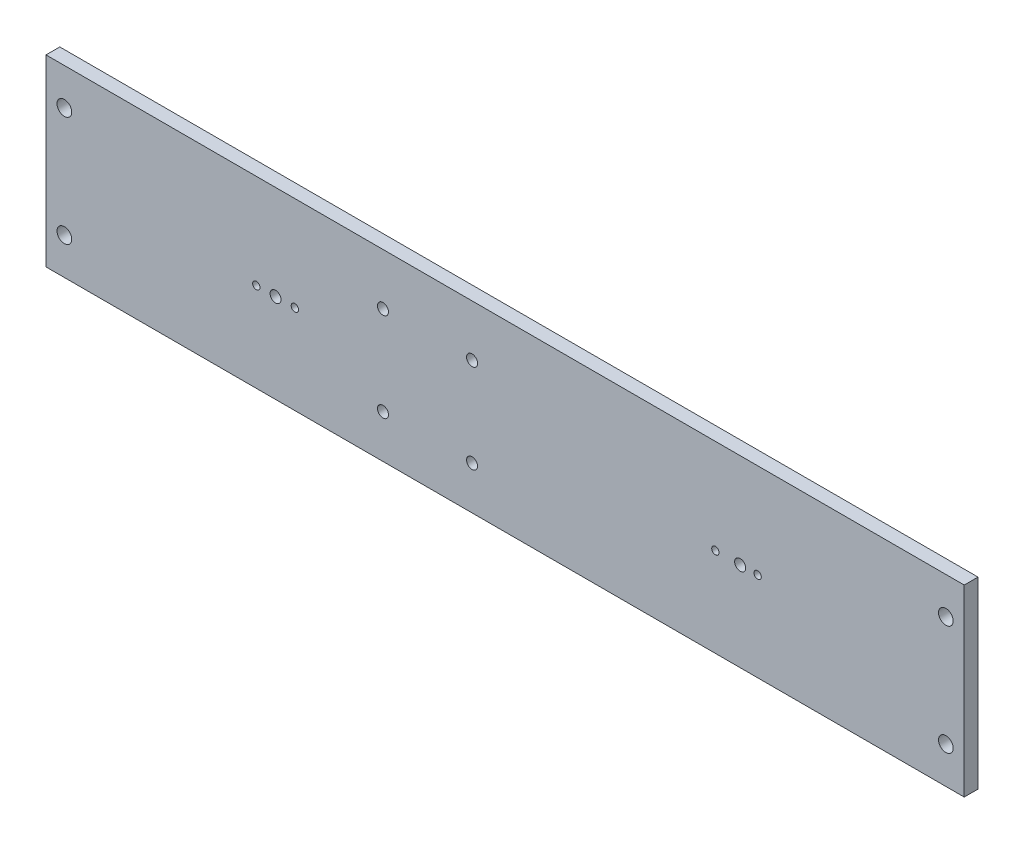
ISO-10303-21;
HEADER;
FILE_DESCRIPTION(('STEP AP214'),'2;1');
FILE_NAME('part.step','',(''),(''),'','','');
FILE_SCHEMA(('AUTOMOTIVE_DESIGN { 1 0 10303 214 1 1 1 1 }'));
ENDSEC;
DATA;
#1=APPLICATION_CONTEXT('core data for automotive mechanical design processes');
#2=APPLICATION_PROTOCOL_DEFINITION('international standard','automotive_design',2000,#1);
#3=PRODUCT_CONTEXT('',#1,'mechanical');
#4=PRODUCT('Part','Part','',(#3));
#5=PRODUCT_RELATED_PRODUCT_CATEGORY('part','',(#4));
#6=PRODUCT_DEFINITION_FORMATION('','',#4);
#7=PRODUCT_DEFINITION_CONTEXT('part definition',#1,'design');
#8=PRODUCT_DEFINITION('design','',#6,#7);
#9=PRODUCT_DEFINITION_SHAPE('','',#8);
#10=(LENGTH_UNIT() NAMED_UNIT(*) SI_UNIT(.MILLI.,.METRE.));
#11=(NAMED_UNIT(*) PLANE_ANGLE_UNIT() SI_UNIT($,.RADIAN.));
#12=(NAMED_UNIT(*) SI_UNIT($,.STERADIAN.) SOLID_ANGLE_UNIT());
#13=UNCERTAINTY_MEASURE_WITH_UNIT(LENGTH_MEASURE(1.E-05),#10,'distance_accuracy_value','');
#14=(GEOMETRIC_REPRESENTATION_CONTEXT(3) GLOBAL_UNCERTAINTY_ASSIGNED_CONTEXT((#13)) GLOBAL_UNIT_ASSIGNED_CONTEXT((#10,
#11,#12)) REPRESENTATION_CONTEXT('',''));
#15=CARTESIAN_POINT('',(0.,0.,0.));
#16=DIRECTION('',(0.,0.,1.));
#17=DIRECTION('',(1.,0.,0.));
#18=AXIS2_PLACEMENT_3D('',#15,#16,#17);
#19=CARTESIAN_POINT('',(0.,100.,7.5));
#20=DIRECTION('',(1.,0.,0.));
#21=DIRECTION('',(0.,1.,0.));
#22=AXIS2_PLACEMENT_3D('',#19,#20,#21);
#23=PLANE('',#22);
#24=DIRECTION('',(0.,-1.,0.));
#25=VECTOR('',#24,1.);
#26=CARTESIAN_POINT('',(0.,100.,0.));
#27=LINE('',#26,#25);
#28=CARTESIAN_POINT('',(0.,100.,0.));
#29=VERTEX_POINT('',#28);
#30=CARTESIAN_POINT('',(0.,0.,0.));
#31=VERTEX_POINT('',#30);
#32=EDGE_CURVE('E100',#29,#31,#27,.T.);
#33=ORIENTED_EDGE('',*,*,#32,.T.);
#34=DIRECTION('',(0.,0.,-1.));
#35=VECTOR('',#34,1.);
#36=CARTESIAN_POINT('',(0.,0.,7.5));
#37=LINE('',#36,#35);
#38=CARTESIAN_POINT('',(0.,0.,7.5));
#39=VERTEX_POINT('',#38);
#40=EDGE_CURVE('E11',#39,#31,#37,.T.);
#41=ORIENTED_EDGE('',*,*,#40,.F.);
#42=DIRECTION('',(0.,-1.,0.));
#43=VECTOR('',#42,1.);
#44=CARTESIAN_POINT('',(0.,100.,7.5));
#45=LINE('',#44,#43);
#46=CARTESIAN_POINT('',(0.,100.,7.5));
#47=VERTEX_POINT('',#46);
#48=EDGE_CURVE('E88',#47,#39,#45,.T.);
#49=ORIENTED_EDGE('',*,*,#48,.F.);
#50=DIRECTION('',(0.,0.,-1.));
#51=VECTOR('',#50,1.);
#52=CARTESIAN_POINT('',(0.,100.,7.5));
#53=LINE('',#52,#51);
#54=EDGE_CURVE('E96',#47,#29,#53,.T.);
#55=ORIENTED_EDGE('',*,*,#54,.T.);
#56=EDGE_LOOP('',(#33,#41,#49,#55));
#57=FACE_BOUND('',#56,.T.);
#58=ADVANCED_FACE('F37',(#57),#23,.F.);
#59=CARTESIAN_POINT('',(0.,0.,7.5));
#60=DIRECTION('',(0.,1.,0.));
#61=DIRECTION('',(0.,0.,1.));
#62=AXIS2_PLACEMENT_3D('',#59,#60,#61);
#63=PLANE('',#62);
#64=DIRECTION('',(1.,0.,0.));
#65=VECTOR('',#64,1.);
#66=CARTESIAN_POINT('',(0.,0.,0.));
#67=LINE('',#66,#65);
#68=CARTESIAN_POINT('',(500.,0.,0.));
#69=VERTEX_POINT('',#68);
#70=EDGE_CURVE('E92',#31,#69,#67,.T.);
#71=ORIENTED_EDGE('',*,*,#70,.T.);
#72=DIRECTION('',(0.,0.,-1.));
#73=VECTOR('',#72,1.);
#74=CARTESIAN_POINT('',(500.,0.,7.5));
#75=LINE('',#74,#73);
#76=CARTESIAN_POINT('',(500.,0.,7.5));
#77=VERTEX_POINT('',#76);
#78=EDGE_CURVE('E45',#77,#69,#75,.T.);
#79=ORIENTED_EDGE('',*,*,#78,.F.);
#80=DIRECTION('',(1.,0.,0.));
#81=VECTOR('',#80,1.);
#82=CARTESIAN_POINT('',(0.,0.,7.5));
#83=LINE('',#82,#81);
#84=EDGE_CURVE('E83',#39,#77,#83,.T.);
#85=ORIENTED_EDGE('',*,*,#84,.F.);
#86=ORIENTED_EDGE('',*,*,#40,.T.);
#87=EDGE_LOOP('',(#71,#79,#85,#86));
#88=FACE_BOUND('',#87,.T.);
#89=ADVANCED_FACE('F91',(#88),#63,.F.);
#90=CARTESIAN_POINT('',(500.,100.,7.5));
#91=DIRECTION('',(-1.,0.,0.));
#92=DIRECTION('',(0.,0.,1.));
#93=AXIS2_PLACEMENT_3D('',#90,#91,#92);
#94=PLANE('',#93);
#95=DIRECTION('',(0.,1.,0.));
#96=VECTOR('',#95,1.);
#97=CARTESIAN_POINT('',(500.,100.,0.));
#98=LINE('',#97,#96);
#99=CARTESIAN_POINT('',(500.,100.,0.));
#100=VERTEX_POINT('',#99);
#101=EDGE_CURVE('E70',#69,#100,#98,.T.);
#102=ORIENTED_EDGE('',*,*,#101,.T.);
#103=DIRECTION('',(0.,0.,-1.));
#104=VECTOR('',#103,1.);
#105=CARTESIAN_POINT('',(500.,100.,7.5));
#106=LINE('',#105,#104);
#107=CARTESIAN_POINT('',(500.,100.,7.5));
#108=VERTEX_POINT('',#107);
#109=EDGE_CURVE('E93',#108,#100,#106,.T.);
#110=ORIENTED_EDGE('',*,*,#109,.F.);
#111=DIRECTION('',(0.,1.,0.));
#112=VECTOR('',#111,1.);
#113=CARTESIAN_POINT('',(500.,100.,7.5));
#114=LINE('',#113,#112);
#115=EDGE_CURVE('E86',#77,#108,#114,.T.);
#116=ORIENTED_EDGE('',*,*,#115,.F.);
#117=ORIENTED_EDGE('',*,*,#78,.T.);
#118=EDGE_LOOP('',(#102,#110,#116,#117));
#119=FACE_BOUND('',#118,.T.);
#120=ADVANCED_FACE('F94',(#119),#94,.F.);
#121=CARTESIAN_POINT('',(0.,100.,7.5));
#122=DIRECTION('',(0.,-1.,0.));
#123=DIRECTION('',(0.,0.,-1.));
#124=AXIS2_PLACEMENT_3D('',#121,#122,#123);
#125=PLANE('',#124);
#126=DIRECTION('',(-1.,0.,0.));
#127=VECTOR('',#126,1.);
#128=CARTESIAN_POINT('',(0.,100.,0.));
#129=LINE('',#128,#127);
#130=EDGE_CURVE('E76',#100,#29,#129,.T.);
#131=ORIENTED_EDGE('',*,*,#130,.T.);
#132=ORIENTED_EDGE('',*,*,#54,.F.);
#133=DIRECTION('',(-1.,0.,0.));
#134=VECTOR('',#133,1.);
#135=CARTESIAN_POINT('',(0.,100.,7.5));
#136=LINE('',#135,#134);
#137=EDGE_CURVE('E53',#108,#47,#136,.T.);
#138=ORIENTED_EDGE('',*,*,#137,.F.);
#139=ORIENTED_EDGE('',*,*,#109,.T.);
#140=EDGE_LOOP('',(#131,#132,#138,#139));
#141=FACE_BOUND('',#140,.T.);
#142=ADVANCED_FACE('F108',(#141),#125,.F.);
#143=CARTESIAN_POINT('',(0.,0.,7.5));
#144=DIRECTION('',(0.,0.,1.));
#145=DIRECTION('',(1.,0.,0.));
#146=AXIS2_PLACEMENT_3D('',#143,#144,#145);
#147=PLANE('',#146);
#148=CARTESIAN_POINT('',(10.0000000000006,20.,7.5));
#149=DIRECTION('',(0.,0.,1.));
#150=DIRECTION('',(1.,0.,0.));
#151=AXIS2_PLACEMENT_3D('',#148,#149,#150);
#152=CIRCLE('',#151,4.);
#153=CARTESIAN_POINT('',(14.0000000000006,20.,7.5));
#154=VERTEX_POINT('',#153);
#155=EDGE_CURVE('E187',#154,#154,#152,.T.);
#156=ORIENTED_EDGE('',*,*,#155,.F.);
#157=EDGE_LOOP('',(#156));
#158=FACE_BOUND('',#157,.T.);
#159=CARTESIAN_POINT('',(490.,80.,7.5));
#160=DIRECTION('',(0.,0.,1.));
#161=DIRECTION('',(1.,0.,0.));
#162=AXIS2_PLACEMENT_3D('',#159,#160,#161);
#163=CIRCLE('',#162,3.99999999999999);
#164=CARTESIAN_POINT('',(494.,80.,7.5));
#165=VERTEX_POINT('',#164);
#166=EDGE_CURVE('E180',#165,#165,#163,.T.);
#167=ORIENTED_EDGE('',*,*,#166,.F.);
#168=EDGE_LOOP('',(#167));
#169=FACE_BOUND('',#168,.T.);
#170=CARTESIAN_POINT('',(490.000000000001,20.,7.5));
#171=DIRECTION('',(0.,0.,1.));
#172=DIRECTION('',(1.,0.,0.));
#173=AXIS2_PLACEMENT_3D('',#170,#171,#172);
#174=CIRCLE('',#173,3.99999999999999);
#175=CARTESIAN_POINT('',(494.000000000001,20.,7.5));
#176=VERTEX_POINT('',#175);
#177=EDGE_CURVE('E192',#176,#176,#174,.T.);
#178=ORIENTED_EDGE('',*,*,#177,.F.);
#179=EDGE_LOOP('',(#178));
#180=FACE_BOUND('',#179,.T.);
#181=CARTESIAN_POINT('',(10.,80.,7.5));
#182=DIRECTION('',(0.,0.,1.));
#183=DIRECTION('',(1.,0.,0.));
#184=AXIS2_PLACEMENT_3D('',#181,#182,#183);
#185=CIRCLE('',#184,4.);
#186=CARTESIAN_POINT('',(14.,80.,7.5));
#187=VERTEX_POINT('',#186);
#188=EDGE_CURVE('E174',#187,#187,#185,.T.);
#189=ORIENTED_EDGE('',*,*,#188,.F.);
#190=EDGE_LOOP('',(#189));
#191=FACE_BOUND('',#190,.T.);
#192=CARTESIAN_POINT('',(135.5,48.5,7.5));
#193=DIRECTION('',(0.,0.,1.));
#194=DIRECTION('',(1.,0.,0.));
#195=AXIS2_PLACEMENT_3D('',#192,#193,#194);
#196=CIRCLE('',#195,2.);
#197=CARTESIAN_POINT('',(137.5,48.5,7.5));
#198=VERTEX_POINT('',#197);
#199=EDGE_CURVE('E163',#198,#198,#196,.T.);
#200=ORIENTED_EDGE('',*,*,#199,.F.);
#201=EDGE_LOOP('',(#200));
#202=FACE_BOUND('',#201,.T.);
#203=CARTESIAN_POINT('',(114.5,48.5,7.5));
#204=DIRECTION('',(0.,0.,1.));
#205=DIRECTION('',(1.,0.,0.));
#206=AXIS2_PLACEMENT_3D('',#203,#204,#205);
#207=CIRCLE('',#206,2.);
#208=CARTESIAN_POINT('',(116.5,48.5,7.5));
#209=VERTEX_POINT('',#208);
#210=EDGE_CURVE('E157',#209,#209,#207,.T.);
#211=ORIENTED_EDGE('',*,*,#210,.F.);
#212=EDGE_LOOP('',(#211));
#213=FACE_BOUND('',#212,.T.);
#214=CARTESIAN_POINT('',(378.,48.5,7.5));
#215=DIRECTION('',(0.,0.,1.));
#216=DIRECTION('',(1.,0.,0.));
#217=AXIS2_PLACEMENT_3D('',#214,#215,#216);
#218=CIRCLE('',#217,2.99999999999994);
#219=CARTESIAN_POINT('',(381.,48.5,7.5));
#220=VERTEX_POINT('',#219);
#221=EDGE_CURVE('E151',#220,#220,#218,.T.);
#222=ORIENTED_EDGE('',*,*,#221,.F.);
#223=EDGE_LOOP('',(#222));
#224=FACE_BOUND('',#223,.T.);
#225=CARTESIAN_POINT('',(387.5,48.5,7.5));
#226=DIRECTION('',(0.,0.,1.));
#227=DIRECTION('',(1.,0.,0.));
#228=AXIS2_PLACEMENT_3D('',#225,#226,#227);
#229=CIRCLE('',#228,2.);
#230=CARTESIAN_POINT('',(389.5,48.5,7.5));
#231=VERTEX_POINT('',#230);
#232=EDGE_CURVE('E144',#231,#231,#229,.T.);
#233=ORIENTED_EDGE('',*,*,#232,.F.);
#234=EDGE_LOOP('',(#233));
#235=FACE_BOUND('',#234,.T.);
#236=CARTESIAN_POINT('',(364.5,48.5,7.5));
#237=DIRECTION('',(0.,0.,1.));
#238=DIRECTION('',(1.,0.,0.));
#239=AXIS2_PLACEMENT_3D('',#236,#237,#238);
#240=CIRCLE('',#239,2.);
#241=CARTESIAN_POINT('',(366.5,48.5,7.5));
#242=VERTEX_POINT('',#241);
#243=EDGE_CURVE('E168',#242,#242,#240,.T.);
#244=ORIENTED_EDGE('',*,*,#243,.F.);
#245=EDGE_LOOP('',(#244));
#246=FACE_BOUND('',#245,.T.);
#247=CARTESIAN_POINT('',(125.,48.5,7.5));
#248=DIRECTION('',(0.,0.,1.));
#249=DIRECTION('',(1.,0.,0.));
#250=AXIS2_PLACEMENT_3D('',#247,#248,#249);
#251=CIRCLE('',#250,2.99999999999999);
#252=CARTESIAN_POINT('',(128.,48.5,7.5));
#253=VERTEX_POINT('',#252);
#254=EDGE_CURVE('E138',#253,#253,#251,.T.);
#255=ORIENTED_EDGE('',*,*,#254,.F.);
#256=EDGE_LOOP('',(#255));
#257=FACE_BOUND('',#256,.T.);
#258=CARTESIAN_POINT('',(183.5,72.,7.5));
#259=DIRECTION('',(0.,0.,1.));
#260=DIRECTION('',(1.,0.,0.));
#261=AXIS2_PLACEMENT_3D('',#258,#259,#260);
#262=CIRCLE('',#261,2.99999999999999);
#263=CARTESIAN_POINT('',(186.5,72.,7.5));
#264=VERTEX_POINT('',#263);
#265=EDGE_CURVE('E127',#264,#264,#262,.T.);
#266=ORIENTED_EDGE('',*,*,#265,.F.);
#267=EDGE_LOOP('',(#266));
#268=FACE_BOUND('',#267,.T.);
#269=CARTESIAN_POINT('',(232.,23.5,7.5));
#270=DIRECTION('',(0.,0.,1.));
#271=DIRECTION('',(1.,0.,0.));
#272=AXIS2_PLACEMENT_3D('',#269,#270,#271);
#273=CIRCLE('',#272,2.99999999999999);
#274=CARTESIAN_POINT('',(235.,23.5,7.5));
#275=VERTEX_POINT('',#274);
#276=EDGE_CURVE('E120',#275,#275,#273,.T.);
#277=ORIENTED_EDGE('',*,*,#276,.F.);
#278=EDGE_LOOP('',(#277));
#279=FACE_BOUND('',#278,.T.);
#280=CARTESIAN_POINT('',(232.,72.,7.5));
#281=DIRECTION('',(0.,0.,1.));
#282=DIRECTION('',(1.,0.,0.));
#283=AXIS2_PLACEMENT_3D('',#280,#281,#282);
#284=CIRCLE('',#283,2.99999999999999);
#285=CARTESIAN_POINT('',(235.,72.,7.5));
#286=VERTEX_POINT('',#285);
#287=EDGE_CURVE('E132',#286,#286,#284,.T.);
#288=ORIENTED_EDGE('',*,*,#287,.F.);
#289=EDGE_LOOP('',(#288));
#290=FACE_BOUND('',#289,.T.);
#291=CARTESIAN_POINT('',(183.5,23.5,7.5));
#292=DIRECTION('',(0.,0.,1.));
#293=DIRECTION('',(1.,0.,0.));
#294=AXIS2_PLACEMENT_3D('',#291,#292,#293);
#295=CIRCLE('',#294,2.99999999999999);
#296=CARTESIAN_POINT('',(186.5,23.5,7.5));
#297=VERTEX_POINT('',#296);
#298=EDGE_CURVE('E114',#297,#297,#295,.T.);
#299=ORIENTED_EDGE('',*,*,#298,.F.);
#300=EDGE_LOOP('',(#299));
#301=FACE_BOUND('',#300,.T.);
#302=ORIENTED_EDGE('',*,*,#48,.T.);
#303=ORIENTED_EDGE('',*,*,#84,.T.);
#304=ORIENTED_EDGE('',*,*,#115,.T.);
#305=ORIENTED_EDGE('',*,*,#137,.T.);
#306=EDGE_LOOP('',(#302,#303,#304,#305));
#307=FACE_BOUND('',#306,.T.);
#308=ADVANCED_FACE('F84',(#158,#169,#180,#191,#202,#213,#224,#235,#246,#257,#268,#279,#290,#301,
#307),#147,.T.);
#309=CARTESIAN_POINT('',(0.,0.,0.));
#310=DIRECTION('',(0.,0.,1.));
#311=DIRECTION('',(1.,0.,0.));
#312=AXIS2_PLACEMENT_3D('',#309,#310,#311);
#313=PLANE('',#312);
#314=CARTESIAN_POINT('',(10.0000000000006,20.,0.));
#315=DIRECTION('',(0.,0.,1.));
#316=DIRECTION('',(1.,0.,0.));
#317=AXIS2_PLACEMENT_3D('',#314,#315,#316);
#318=CIRCLE('',#317,4.);
#319=CARTESIAN_POINT('',(14.0000000000006,20.,0.));
#320=VERTEX_POINT('',#319);
#321=EDGE_CURVE('E177',#320,#320,#318,.T.);
#322=ORIENTED_EDGE('',*,*,#321,.T.);
#323=EDGE_LOOP('',(#322));
#324=FACE_BOUND('',#323,.T.);
#325=CARTESIAN_POINT('',(490.,80.,0.));
#326=DIRECTION('',(0.,0.,1.));
#327=DIRECTION('',(1.,0.,0.));
#328=AXIS2_PLACEMENT_3D('',#325,#326,#327);
#329=CIRCLE('',#328,3.99999999999999);
#330=CARTESIAN_POINT('',(494.,80.,0.));
#331=VERTEX_POINT('',#330);
#332=EDGE_CURVE('E183',#331,#331,#329,.T.);
#333=ORIENTED_EDGE('',*,*,#332,.T.);
#334=EDGE_LOOP('',(#333));
#335=FACE_BOUND('',#334,.T.);
#336=CARTESIAN_POINT('',(490.000000000001,20.,0.));
#337=DIRECTION('',(0.,0.,1.));
#338=DIRECTION('',(1.,0.,0.));
#339=AXIS2_PLACEMENT_3D('',#336,#337,#338);
#340=CIRCLE('',#339,3.99999999999999);
#341=CARTESIAN_POINT('',(494.000000000001,20.,0.));
#342=VERTEX_POINT('',#341);
#343=EDGE_CURVE('E184',#342,#342,#340,.T.);
#344=ORIENTED_EDGE('',*,*,#343,.T.);
#345=EDGE_LOOP('',(#344));
#346=FACE_BOUND('',#345,.T.);
#347=CARTESIAN_POINT('',(10.,80.,0.));
#348=DIRECTION('',(0.,0.,1.));
#349=DIRECTION('',(1.,0.,0.));
#350=AXIS2_PLACEMENT_3D('',#347,#348,#349);
#351=CIRCLE('',#350,4.);
#352=CARTESIAN_POINT('',(14.,80.,0.));
#353=VERTEX_POINT('',#352);
#354=EDGE_CURVE('E171',#353,#353,#351,.T.);
#355=ORIENTED_EDGE('',*,*,#354,.T.);
#356=EDGE_LOOP('',(#355));
#357=FACE_BOUND('',#356,.T.);
#358=CARTESIAN_POINT('',(135.5,48.5,0.));
#359=DIRECTION('',(0.,0.,1.));
#360=DIRECTION('',(1.,0.,0.));
#361=AXIS2_PLACEMENT_3D('',#358,#359,#360);
#362=CIRCLE('',#361,2.);
#363=CARTESIAN_POINT('',(137.5,48.5,0.));
#364=VERTEX_POINT('',#363);
#365=EDGE_CURVE('E141',#364,#364,#362,.T.);
#366=ORIENTED_EDGE('',*,*,#365,.T.);
#367=EDGE_LOOP('',(#366));
#368=FACE_BOUND('',#367,.T.);
#369=CARTESIAN_POINT('',(114.5,48.5,0.));
#370=DIRECTION('',(0.,0.,1.));
#371=DIRECTION('',(1.,0.,0.));
#372=AXIS2_PLACEMENT_3D('',#369,#370,#371);
#373=CIRCLE('',#372,2.);
#374=CARTESIAN_POINT('',(116.5,48.5,0.));
#375=VERTEX_POINT('',#374);
#376=EDGE_CURVE('E160',#375,#375,#373,.T.);
#377=ORIENTED_EDGE('',*,*,#376,.T.);
#378=EDGE_LOOP('',(#377));
#379=FACE_BOUND('',#378,.T.);
#380=CARTESIAN_POINT('',(378.,48.5,0.));
#381=DIRECTION('',(0.,0.,1.));
#382=DIRECTION('',(1.,0.,0.));
#383=AXIS2_PLACEMENT_3D('',#380,#381,#382);
#384=CIRCLE('',#383,2.99999999999994);
#385=CARTESIAN_POINT('',(381.,48.5,0.));
#386=VERTEX_POINT('',#385);
#387=EDGE_CURVE('E154',#386,#386,#384,.T.);
#388=ORIENTED_EDGE('',*,*,#387,.T.);
#389=EDGE_LOOP('',(#388));
#390=FACE_BOUND('',#389,.T.);
#391=CARTESIAN_POINT('',(387.5,48.5,0.));
#392=DIRECTION('',(0.,0.,1.));
#393=DIRECTION('',(1.,0.,0.));
#394=AXIS2_PLACEMENT_3D('',#391,#392,#393);
#395=CIRCLE('',#394,2.);
#396=CARTESIAN_POINT('',(389.5,48.5,0.));
#397=VERTEX_POINT('',#396);
#398=EDGE_CURVE('E147',#397,#397,#395,.T.);
#399=ORIENTED_EDGE('',*,*,#398,.T.);
#400=EDGE_LOOP('',(#399));
#401=FACE_BOUND('',#400,.T.);
#402=CARTESIAN_POINT('',(364.5,48.5,0.));
#403=DIRECTION('',(0.,0.,1.));
#404=DIRECTION('',(1.,0.,0.));
#405=AXIS2_PLACEMENT_3D('',#402,#403,#404);
#406=CIRCLE('',#405,2.);
#407=CARTESIAN_POINT('',(366.5,48.5,0.));
#408=VERTEX_POINT('',#407);
#409=EDGE_CURVE('E148',#408,#408,#406,.T.);
#410=ORIENTED_EDGE('',*,*,#409,.T.);
#411=EDGE_LOOP('',(#410));
#412=FACE_BOUND('',#411,.T.);
#413=CARTESIAN_POINT('',(125.,48.5,0.));
#414=DIRECTION('',(0.,0.,1.));
#415=DIRECTION('',(1.,0.,0.));
#416=AXIS2_PLACEMENT_3D('',#413,#414,#415);
#417=CIRCLE('',#416,2.99999999999999);
#418=CARTESIAN_POINT('',(128.,48.5,0.));
#419=VERTEX_POINT('',#418);
#420=EDGE_CURVE('E135',#419,#419,#417,.T.);
#421=ORIENTED_EDGE('',*,*,#420,.T.);
#422=EDGE_LOOP('',(#421));
#423=FACE_BOUND('',#422,.T.);
#424=CARTESIAN_POINT('',(183.5,72.,0.));
#425=DIRECTION('',(0.,0.,1.));
#426=DIRECTION('',(1.,0.,0.));
#427=AXIS2_PLACEMENT_3D('',#424,#425,#426);
#428=CIRCLE('',#427,2.99999999999999);
#429=CARTESIAN_POINT('',(186.5,72.,0.));
#430=VERTEX_POINT('',#429);
#431=EDGE_CURVE('E117',#430,#430,#428,.T.);
#432=ORIENTED_EDGE('',*,*,#431,.T.);
#433=EDGE_LOOP('',(#432));
#434=FACE_BOUND('',#433,.T.);
#435=CARTESIAN_POINT('',(232.,23.5,0.));
#436=DIRECTION('',(0.,0.,1.));
#437=DIRECTION('',(1.,0.,0.));
#438=AXIS2_PLACEMENT_3D('',#435,#436,#437);
#439=CIRCLE('',#438,2.99999999999999);
#440=CARTESIAN_POINT('',(235.,23.5,0.));
#441=VERTEX_POINT('',#440);
#442=EDGE_CURVE('E123',#441,#441,#439,.T.);
#443=ORIENTED_EDGE('',*,*,#442,.T.);
#444=EDGE_LOOP('',(#443));
#445=FACE_BOUND('',#444,.T.);
#446=CARTESIAN_POINT('',(232.,72.,0.));
#447=DIRECTION('',(0.,0.,1.));
#448=DIRECTION('',(1.,0.,0.));
#449=AXIS2_PLACEMENT_3D('',#446,#447,#448);
#450=CIRCLE('',#449,2.99999999999999);
#451=CARTESIAN_POINT('',(235.,72.,0.));
#452=VERTEX_POINT('',#451);
#453=EDGE_CURVE('E124',#452,#452,#450,.T.);
#454=ORIENTED_EDGE('',*,*,#453,.T.);
#455=EDGE_LOOP('',(#454));
#456=FACE_BOUND('',#455,.T.);
#457=CARTESIAN_POINT('',(183.5,23.5,0.));
#458=DIRECTION('',(0.,0.,1.));
#459=DIRECTION('',(1.,0.,0.));
#460=AXIS2_PLACEMENT_3D('',#457,#458,#459);
#461=CIRCLE('',#460,2.99999999999999);
#462=CARTESIAN_POINT('',(186.5,23.5,0.));
#463=VERTEX_POINT('',#462);
#464=EDGE_CURVE('E103',#463,#463,#461,.T.);
#465=ORIENTED_EDGE('',*,*,#464,.T.);
#466=EDGE_LOOP('',(#465));
#467=FACE_BOUND('',#466,.T.);
#468=ORIENTED_EDGE('',*,*,#32,.F.);
#469=ORIENTED_EDGE('',*,*,#130,.F.);
#470=ORIENTED_EDGE('',*,*,#101,.F.);
#471=ORIENTED_EDGE('',*,*,#70,.F.);
#472=EDGE_LOOP('',(#468,#469,#470,#471));
#473=FACE_BOUND('',#472,.T.);
#474=ADVANCED_FACE('F111',(#324,#335,#346,#357,#368,#379,#390,#401,#412,#423,#434,#445,#456,
#467,#473),#313,.F.);
#475=CARTESIAN_POINT('',(183.5,23.5,0.));
#476=DIRECTION('',(0.,0.,1.));
#477=DIRECTION('',(1.,0.,0.));
#478=AXIS2_PLACEMENT_3D('',#475,#476,#477);
#479=CYLINDRICAL_SURFACE('',#478,2.99999999999999);
#480=ORIENTED_EDGE('',*,*,#464,.F.);
#481=EDGE_LOOP('',(#480));
#482=FACE_BOUND('',#481,.T.);
#483=ORIENTED_EDGE('',*,*,#298,.T.);
#484=EDGE_LOOP('',(#483));
#485=FACE_BOUND('',#484,.T.);
#486=ADVANCED_FACE('F234',(#482,#485),#479,.F.);
#487=CARTESIAN_POINT('',(232.,72.,0.));
#488=DIRECTION('',(0.,0.,1.));
#489=DIRECTION('',(1.,0.,0.));
#490=AXIS2_PLACEMENT_3D('',#487,#488,#489);
#491=CYLINDRICAL_SURFACE('',#490,2.99999999999999);
#492=ORIENTED_EDGE('',*,*,#453,.F.);
#493=EDGE_LOOP('',(#492));
#494=FACE_BOUND('',#493,.T.);
#495=ORIENTED_EDGE('',*,*,#287,.T.);
#496=EDGE_LOOP('',(#495));
#497=FACE_BOUND('',#496,.T.);
#498=ADVANCED_FACE('F236',(#494,#497),#491,.F.);
#499=CARTESIAN_POINT('',(232.,23.5,0.));
#500=DIRECTION('',(0.,0.,1.));
#501=DIRECTION('',(1.,0.,0.));
#502=AXIS2_PLACEMENT_3D('',#499,#500,#501);
#503=CYLINDRICAL_SURFACE('',#502,2.99999999999999);
#504=ORIENTED_EDGE('',*,*,#442,.F.);
#505=EDGE_LOOP('',(#504));
#506=FACE_BOUND('',#505,.T.);
#507=ORIENTED_EDGE('',*,*,#276,.T.);
#508=EDGE_LOOP('',(#507));
#509=FACE_BOUND('',#508,.T.);
#510=ADVANCED_FACE('F243',(#506,#509),#503,.F.);
#511=CARTESIAN_POINT('',(183.5,72.,0.));
#512=DIRECTION('',(0.,0.,1.));
#513=DIRECTION('',(1.,0.,0.));
#514=AXIS2_PLACEMENT_3D('',#511,#512,#513);
#515=CYLINDRICAL_SURFACE('',#514,2.99999999999999);
#516=ORIENTED_EDGE('',*,*,#431,.F.);
#517=EDGE_LOOP('',(#516));
#518=FACE_BOUND('',#517,.T.);
#519=ORIENTED_EDGE('',*,*,#265,.T.);
#520=EDGE_LOOP('',(#519));
#521=FACE_BOUND('',#520,.T.);
#522=ADVANCED_FACE('F338',(#518,#521),#515,.F.);
#523=CARTESIAN_POINT('',(125.,48.5,0.));
#524=DIRECTION('',(0.,0.,1.));
#525=DIRECTION('',(1.,0.,0.));
#526=AXIS2_PLACEMENT_3D('',#523,#524,#525);
#527=CYLINDRICAL_SURFACE('',#526,2.99999999999999);
#528=ORIENTED_EDGE('',*,*,#420,.F.);
#529=EDGE_LOOP('',(#528));
#530=FACE_BOUND('',#529,.T.);
#531=ORIENTED_EDGE('',*,*,#254,.T.);
#532=EDGE_LOOP('',(#531));
#533=FACE_BOUND('',#532,.T.);
#534=ADVANCED_FACE('F322',(#530,#533),#527,.F.);
#535=CARTESIAN_POINT('',(364.5,48.5,0.));
#536=DIRECTION('',(0.,0.,1.));
#537=DIRECTION('',(1.,0.,0.));
#538=AXIS2_PLACEMENT_3D('',#535,#536,#537);
#539=CYLINDRICAL_SURFACE('',#538,2.);
#540=ORIENTED_EDGE('',*,*,#409,.F.);
#541=EDGE_LOOP('',(#540));
#542=FACE_BOUND('',#541,.T.);
#543=ORIENTED_EDGE('',*,*,#243,.T.);
#544=EDGE_LOOP('',(#543));
#545=FACE_BOUND('',#544,.T.);
#546=ADVANCED_FACE('F318',(#542,#545),#539,.F.);
#547=CARTESIAN_POINT('',(387.5,48.5,0.));
#548=DIRECTION('',(0.,0.,1.));
#549=DIRECTION('',(1.,0.,0.));
#550=AXIS2_PLACEMENT_3D('',#547,#548,#549);
#551=CYLINDRICAL_SURFACE('',#550,2.);
#552=ORIENTED_EDGE('',*,*,#398,.F.);
#553=EDGE_LOOP('',(#552));
#554=FACE_BOUND('',#553,.T.);
#555=ORIENTED_EDGE('',*,*,#232,.T.);
#556=EDGE_LOOP('',(#555));
#557=FACE_BOUND('',#556,.T.);
#558=ADVANCED_FACE('F321',(#554,#557),#551,.F.);
#559=CARTESIAN_POINT('',(378.,48.5,0.));
#560=DIRECTION('',(0.,0.,1.));
#561=DIRECTION('',(1.,0.,0.));
#562=AXIS2_PLACEMENT_3D('',#559,#560,#561);
#563=CYLINDRICAL_SURFACE('',#562,2.99999999999994);
#564=ORIENTED_EDGE('',*,*,#387,.F.);
#565=EDGE_LOOP('',(#564));
#566=FACE_BOUND('',#565,.T.);
#567=ORIENTED_EDGE('',*,*,#221,.T.);
#568=EDGE_LOOP('',(#567));
#569=FACE_BOUND('',#568,.T.);
#570=ADVANCED_FACE('F329',(#566,#569),#563,.F.);
#571=CARTESIAN_POINT('',(114.5,48.5,0.));
#572=DIRECTION('',(0.,0.,1.));
#573=DIRECTION('',(1.,0.,0.));
#574=AXIS2_PLACEMENT_3D('',#571,#572,#573);
#575=CYLINDRICAL_SURFACE('',#574,2.);
#576=ORIENTED_EDGE('',*,*,#376,.F.);
#577=EDGE_LOOP('',(#576));
#578=FACE_BOUND('',#577,.T.);
#579=ORIENTED_EDGE('',*,*,#210,.T.);
#580=EDGE_LOOP('',(#579));
#581=FACE_BOUND('',#580,.T.);
#582=ADVANCED_FACE('F325',(#578,#581),#575,.F.);
#583=CARTESIAN_POINT('',(135.5,48.5,0.));
#584=DIRECTION('',(0.,0.,1.));
#585=DIRECTION('',(1.,0.,0.));
#586=AXIS2_PLACEMENT_3D('',#583,#584,#585);
#587=CYLINDRICAL_SURFACE('',#586,2.);
#588=ORIENTED_EDGE('',*,*,#365,.F.);
#589=EDGE_LOOP('',(#588));
#590=FACE_BOUND('',#589,.T.);
#591=ORIENTED_EDGE('',*,*,#199,.T.);
#592=EDGE_LOOP('',(#591));
#593=FACE_BOUND('',#592,.T.);
#594=ADVANCED_FACE('F283',(#590,#593),#587,.F.);
#595=CARTESIAN_POINT('',(10.,80.,0.));
#596=DIRECTION('',(0.,0.,1.));
#597=DIRECTION('',(1.,0.,0.));
#598=AXIS2_PLACEMENT_3D('',#595,#596,#597);
#599=CYLINDRICAL_SURFACE('',#598,4.);
#600=ORIENTED_EDGE('',*,*,#354,.F.);
#601=EDGE_LOOP('',(#600));
#602=FACE_BOUND('',#601,.T.);
#603=ORIENTED_EDGE('',*,*,#188,.T.);
#604=EDGE_LOOP('',(#603));
#605=FACE_BOUND('',#604,.T.);
#606=ADVANCED_FACE('F204',(#602,#605),#599,.F.);
#607=CARTESIAN_POINT('',(490.000000000001,20.,0.));
#608=DIRECTION('',(0.,0.,1.));
#609=DIRECTION('',(1.,0.,0.));
#610=AXIS2_PLACEMENT_3D('',#607,#608,#609);
#611=CYLINDRICAL_SURFACE('',#610,3.99999999999999);
#612=ORIENTED_EDGE('',*,*,#343,.F.);
#613=EDGE_LOOP('',(#612));
#614=FACE_BOUND('',#613,.T.);
#615=ORIENTED_EDGE('',*,*,#177,.T.);
#616=EDGE_LOOP('',(#615));
#617=FACE_BOUND('',#616,.T.);
#618=ADVANCED_FACE('F200',(#614,#617),#611,.F.);
#619=CARTESIAN_POINT('',(490.,80.,0.));
#620=DIRECTION('',(0.,0.,1.));
#621=DIRECTION('',(1.,0.,0.));
#622=AXIS2_PLACEMENT_3D('',#619,#620,#621);
#623=CYLINDRICAL_SURFACE('',#622,3.99999999999999);
#624=ORIENTED_EDGE('',*,*,#332,.F.);
#625=EDGE_LOOP('',(#624));
#626=FACE_BOUND('',#625,.T.);
#627=ORIENTED_EDGE('',*,*,#166,.T.);
#628=EDGE_LOOP('',(#627));
#629=FACE_BOUND('',#628,.T.);
#630=ADVANCED_FACE('F203',(#626,#629),#623,.F.);
#631=CARTESIAN_POINT('',(10.0000000000006,20.,0.));
#632=DIRECTION('',(0.,0.,1.));
#633=DIRECTION('',(1.,0.,0.));
#634=AXIS2_PLACEMENT_3D('',#631,#632,#633);
#635=CYLINDRICAL_SURFACE('',#634,4.);
#636=ORIENTED_EDGE('',*,*,#321,.F.);
#637=EDGE_LOOP('',(#636));
#638=FACE_BOUND('',#637,.T.);
#639=ORIENTED_EDGE('',*,*,#155,.T.);
#640=EDGE_LOOP('',(#639));
#641=FACE_BOUND('',#640,.T.);
#642=ADVANCED_FACE('F301',(#638,#641),#635,.F.);
#643=CLOSED_SHELL('',(#58,#89,#120,#142,#308,#474,#486,#498,#510,#522,#534,#546,#558,#570,#582,
#594,#606,#618,#630,#642));
#644=MANIFOLD_SOLID_BREP('B2',#643);
#645=ADVANCED_BREP_SHAPE_REPRESENTATION('',(#18,#644),#14);
#646=SHAPE_DEFINITION_REPRESENTATION(#9,#645);
ENDSEC;
END-ISO-10303-21;
